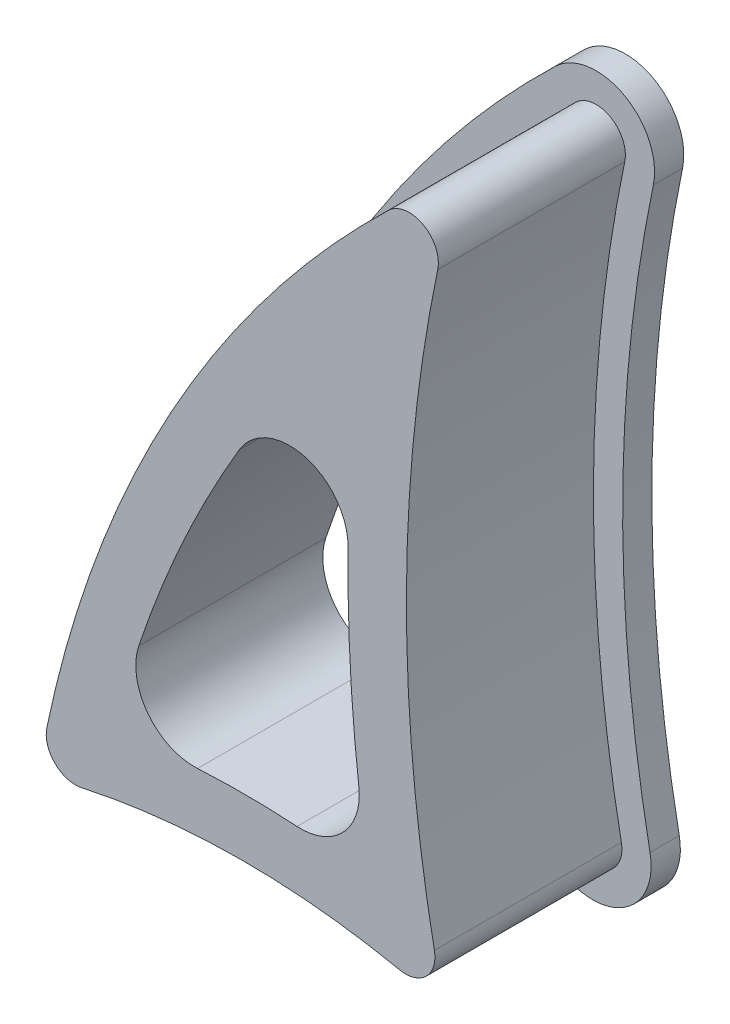
ISO-10303-21;
HEADER;
FILE_DESCRIPTION(('STEP AP214'),'2;1');
FILE_NAME('part.step','',(''),(''),'','','');
FILE_SCHEMA(('AUTOMOTIVE_DESIGN { 1 0 10303 214 1 1 1 1 }'));
ENDSEC;
DATA;
#1=APPLICATION_CONTEXT('core data for automotive mechanical design processes');
#2=APPLICATION_PROTOCOL_DEFINITION('international standard','automotive_design',2000,#1);
#3=PRODUCT_CONTEXT('',#1,'mechanical');
#4=PRODUCT('Part','Part','',(#3));
#5=PRODUCT_RELATED_PRODUCT_CATEGORY('part','',(#4));
#6=PRODUCT_DEFINITION_FORMATION('','',#4);
#7=PRODUCT_DEFINITION_CONTEXT('part definition',#1,'design');
#8=PRODUCT_DEFINITION('design','',#6,#7);
#9=PRODUCT_DEFINITION_SHAPE('','',#8);
#10=(LENGTH_UNIT() NAMED_UNIT(*) SI_UNIT(.MILLI.,.METRE.));
#11=(NAMED_UNIT(*) PLANE_ANGLE_UNIT() SI_UNIT($,.RADIAN.));
#12=(NAMED_UNIT(*) SI_UNIT($,.STERADIAN.) SOLID_ANGLE_UNIT());
#13=UNCERTAINTY_MEASURE_WITH_UNIT(LENGTH_MEASURE(1.E-05),#10,'distance_accuracy_value','');
#14=(GEOMETRIC_REPRESENTATION_CONTEXT(3) GLOBAL_UNCERTAINTY_ASSIGNED_CONTEXT((#13)) GLOBAL_UNIT_ASSIGNED_CONTEXT((#10,
#11,#12)) REPRESENTATION_CONTEXT('',''));
#15=CARTESIAN_POINT('',(0.,0.,0.));
#16=DIRECTION('',(0.,0.,1.));
#17=DIRECTION('',(1.,0.,0.));
#18=AXIS2_PLACEMENT_3D('',#15,#16,#17);
#19=CARTESIAN_POINT('',(48.320297770506,12.8510242148101,-1.));
#20=DIRECTION('',(0.,0.,1.));
#21=DIRECTION('',(1.,0.,0.));
#22=AXIS2_PLACEMENT_3D('',#19,#20,#21);
#23=CYLINDRICAL_SURFACE('',#22,50.);
#24=CARTESIAN_POINT('',(48.320297770506,12.8510242148101,0.));
#25=DIRECTION('',(0.,0.,1.));
#26=DIRECTION('',(1.,0.,0.));
#27=AXIS2_PLACEMENT_3D('',#24,#25,#26);
#28=CIRCLE('',#27,50.);
#29=CARTESIAN_POINT('',(-0.741475267234573,3.21035896840541,0.));
#30=VERTEX_POINT('',#29);
#31=CARTESIAN_POINT('',(-0.628577803238606,23.0494348785397,0.));
#32=VERTEX_POINT('',#31);
#33=EDGE_CURVE('E183',#30,#32,#28,.F.);
#34=ORIENTED_EDGE('',*,*,#33,.F.);
#35=DIRECTION('',(0.,0.,1.));
#36=VECTOR('',#35,1.);
#37=CARTESIAN_POINT('',(-0.741475267234573,3.21035896840541,-1.));
#38=LINE('',#37,#36);
#39=CARTESIAN_POINT('',(-0.741475267234573,3.21035896840541,-1.));
#40=VERTEX_POINT('',#39);
#41=EDGE_CURVE('E12',#40,#30,#38,.T.);
#42=ORIENTED_EDGE('',*,*,#41,.F.);
#43=CARTESIAN_POINT('',(48.320297770506,12.8510242148101,-1.));
#44=DIRECTION('',(0.,0.,1.));
#45=DIRECTION('',(1.,0.,0.));
#46=AXIS2_PLACEMENT_3D('',#43,#44,#45);
#47=CIRCLE('',#46,50.);
#48=CARTESIAN_POINT('',(-0.628577803238606,23.0494348785397,-1.));
#49=VERTEX_POINT('',#48);
#50=EDGE_CURVE('E236',#40,#49,#47,.F.);
#51=ORIENTED_EDGE('',*,*,#50,.T.);
#52=DIRECTION('',(0.,0.,1.));
#53=VECTOR('',#52,1.);
#54=CARTESIAN_POINT('',(-0.628577803238606,23.0494348785397,-1.));
#55=LINE('',#54,#53);
#56=EDGE_CURVE('E203',#49,#32,#55,.T.);
#57=ORIENTED_EDGE('',*,*,#56,.T.);
#58=EDGE_LOOP('',(#34,#42,#51,#57));
#59=FACE_BOUND('',#58,.T.);
#60=ADVANCED_FACE('F47',(#59),#23,.F.);
#61=CARTESIAN_POINT('',(-2.70394618874419,2.82473235854923,-1.));
#62=DIRECTION('',(0.,0.,1.));
#63=DIRECTION('',(1.,0.,0.));
#64=AXIS2_PLACEMENT_3D('',#61,#62,#63);
#65=CYLINDRICAL_SURFACE('',#64,2.);
#66=CARTESIAN_POINT('',(-2.70394618874419,2.82473235854923,0.));
#67=DIRECTION('',(0.,0.,1.));
#68=DIRECTION('',(1.,0.,0.));
#69=AXIS2_PLACEMENT_3D('',#66,#67,#68);
#70=CIRCLE('',#69,2.);
#71=CARTESIAN_POINT('',(-3.11476498957796,0.867380087525561,0.));
#72=VERTEX_POINT('',#71);
#73=EDGE_CURVE('E195',#72,#30,#70,.T.);
#74=ORIENTED_EDGE('',*,*,#73,.F.);
#75=DIRECTION('',(0.,0.,1.));
#76=VECTOR('',#75,1.);
#77=CARTESIAN_POINT('',(-3.11476498957796,0.867380087525561,-1.));
#78=LINE('',#77,#76);
#79=CARTESIAN_POINT('',(-3.11476498957796,0.867380087525561,-1.));
#80=VERTEX_POINT('',#79);
#81=EDGE_CURVE('E57',#80,#72,#78,.T.);
#82=ORIENTED_EDGE('',*,*,#81,.F.);
#83=CARTESIAN_POINT('',(-2.70394618874419,2.82473235854923,-1.));
#84=DIRECTION('',(0.,0.,1.));
#85=DIRECTION('',(1.,0.,0.));
#86=AXIS2_PLACEMENT_3D('',#83,#84,#85);
#87=CIRCLE('',#86,2.);
#88=EDGE_CURVE('E163',#80,#40,#87,.T.);
#89=ORIENTED_EDGE('',*,*,#88,.T.);
#90=ORIENTED_EDGE('',*,*,#41,.T.);
#91=EDGE_LOOP('',(#74,#82,#89,#90));
#92=FACE_BOUND('',#91,.T.);
#93=ADVANCED_FACE('F257',(#92),#65,.T.);
#94=CARTESIAN_POINT('',(-8.25,-23.5995233002703,-1.));
#95=DIRECTION('',(0.,0.,1.));
#96=DIRECTION('',(1.,0.,0.));
#97=AXIS2_PLACEMENT_3D('',#94,#95,#96);
#98=CYLINDRICAL_SURFACE('',#97,25.);
#99=CARTESIAN_POINT('',(-8.25,-23.5995233002703,0.));
#100=DIRECTION('',(0.,0.,1.));
#101=DIRECTION('',(1.,0.,0.));
#102=AXIS2_PLACEMENT_3D('',#99,#100,#101);
#103=CIRCLE('',#102,25.);
#104=CARTESIAN_POINT('',(-13.5802631482474,0.825633705784666,0.));
#105=VERTEX_POINT('',#104);
#106=EDGE_CURVE('E148',#105,#72,#103,.F.);
#107=ORIENTED_EDGE('',*,*,#106,.F.);
#108=DIRECTION('',(0.,0.,1.));
#109=VECTOR('',#108,1.);
#110=CARTESIAN_POINT('',(-13.5802631482474,0.825633705784666,-1.));
#111=LINE('',#110,#109);
#112=CARTESIAN_POINT('',(-13.5802631482474,0.825633705784666,-1.));
#113=VERTEX_POINT('',#112);
#114=EDGE_CURVE('E142',#113,#105,#111,.T.);
#115=ORIENTED_EDGE('',*,*,#114,.F.);
#116=CARTESIAN_POINT('',(-8.25,-23.5995233002703,-1.));
#117=DIRECTION('',(0.,0.,1.));
#118=DIRECTION('',(1.,0.,0.));
#119=AXIS2_PLACEMENT_3D('',#116,#117,#118);
#120=CIRCLE('',#119,25.);
#121=EDGE_CURVE('E146',#113,#80,#120,.F.);
#122=ORIENTED_EDGE('',*,*,#121,.T.);
#123=ORIENTED_EDGE('',*,*,#81,.T.);
#124=EDGE_LOOP('',(#107,#115,#122,#123));
#125=FACE_BOUND('',#124,.T.);
#126=ADVANCED_FACE('F144',(#125),#98,.F.);
#127=CARTESIAN_POINT('',(-14.0066842001072,2.77964626626907,-1.));
#128=DIRECTION('',(0.,0.,1.));
#129=DIRECTION('',(1.,0.,0.));
#130=AXIS2_PLACEMENT_3D('',#127,#128,#129);
#131=CYLINDRICAL_SURFACE('',#130,2.);
#132=CARTESIAN_POINT('',(-14.0066842001072,2.77964626626907,0.));
#133=DIRECTION('',(0.,0.,1.));
#134=DIRECTION('',(1.,0.,0.));
#135=AXIS2_PLACEMENT_3D('',#132,#133,#134);
#136=CIRCLE('',#135,2.);
#137=CARTESIAN_POINT('',(-15.9648626723684,3.1865087378403,0.));
#138=VERTEX_POINT('',#137);
#139=EDGE_CURVE('E192',#105,#138,#136,.F.);
#140=ORIENTED_EDGE('',*,*,#139,.T.);
#141=DIRECTION('',(0.,0.,1.));
#142=VECTOR('',#141,1.);
#143=CARTESIAN_POINT('',(-15.9648626723684,3.1865087378403,-1.));
#144=LINE('',#143,#142);
#145=CARTESIAN_POINT('',(-15.9648626723684,3.1865087378403,-1.));
#146=VERTEX_POINT('',#145);
#147=EDGE_CURVE('E152',#146,#138,#144,.T.);
#148=ORIENTED_EDGE('',*,*,#147,.F.);
#149=CARTESIAN_POINT('',(-14.0066842001072,2.77964626626907,-1.));
#150=DIRECTION('',(0.,0.,1.));
#151=DIRECTION('',(1.,0.,0.));
#152=AXIS2_PLACEMENT_3D('',#149,#150,#151);
#153=CIRCLE('',#152,2.);
#154=EDGE_CURVE('E155',#113,#146,#153,.F.);
#155=ORIENTED_EDGE('',*,*,#154,.F.);
#156=ORIENTED_EDGE('',*,*,#114,.T.);
#157=EDGE_LOOP('',(#140,#148,#155,#156));
#158=FACE_BOUND('',#157,.T.);
#159=ADVANCED_FACE('F156',(#158),#131,.T.);
#160=CARTESIAN_POINT('',(25.1568852451154,-5.35760316515583,-1.));
#161=DIRECTION('',(0.,0.,1.));
#162=DIRECTION('',(1.,0.,0.));
#163=AXIS2_PLACEMENT_3D('',#160,#161,#162);
#164=CYLINDRICAL_SURFACE('',#163,42.);
#165=CARTESIAN_POINT('',(25.1568852451154,-5.35760316515583,0.));
#166=DIRECTION('',(0.,0.,1.));
#167=DIRECTION('',(1.,0.,0.));
#168=AXIS2_PLACEMENT_3D('',#165,#166,#167);
#169=CIRCLE('',#168,42.);
#170=CARTESIAN_POINT('',(-3.97370372975359,24.8981200286011,0.));
#171=VERTEX_POINT('',#170);
#172=EDGE_CURVE('E189',#171,#138,#169,.T.);
#173=ORIENTED_EDGE('',*,*,#172,.F.);
#174=DIRECTION('',(0.,0.,1.));
#175=VECTOR('',#174,1.);
#176=CARTESIAN_POINT('',(-3.97370372975359,24.8981200286011,-1.));
#177=LINE('',#176,#175);
#178=CARTESIAN_POINT('',(-3.97370372975359,24.8981200286011,-1.));
#179=VERTEX_POINT('',#178);
#180=EDGE_CURVE('E201',#179,#171,#177,.T.);
#181=ORIENTED_EDGE('',*,*,#180,.F.);
#182=CARTESIAN_POINT('',(25.1568852451154,-5.35760316515583,-1.));
#183=DIRECTION('',(0.,0.,1.));
#184=DIRECTION('',(1.,0.,0.));
#185=AXIS2_PLACEMENT_3D('',#182,#183,#184);
#186=CIRCLE('',#185,42.);
#187=EDGE_CURVE('E160',#179,#146,#186,.T.);
#188=ORIENTED_EDGE('',*,*,#187,.T.);
#189=ORIENTED_EDGE('',*,*,#147,.T.);
#190=EDGE_LOOP('',(#173,#181,#188,#189));
#191=FACE_BOUND('',#190,.T.);
#192=ADVANCED_FACE('F252',(#191),#164,.T.);
#193=CARTESIAN_POINT('',(-2.58653282618839,23.4573713050889,-1.));
#194=DIRECTION('',(0.,0.,1.));
#195=DIRECTION('',(1.,0.,0.));
#196=AXIS2_PLACEMENT_3D('',#193,#194,#195);
#197=CYLINDRICAL_SURFACE('',#196,1.);
#198=CARTESIAN_POINT('',(-2.58653282618839,23.4573713050889,0.));
#199=DIRECTION('',(0.,0.,1.));
#200=DIRECTION('',(1.,0.,0.));
#201=AXIS2_PLACEMENT_3D('',#198,#199,#200);
#202=CIRCLE('',#201,1.);
#203=CARTESIAN_POINT('',(-1.60755531471349,23.2534030918143,0.));
#204=VERTEX_POINT('',#203);
#205=CARTESIAN_POINT('',(-3.28011827797098,24.177745666845,0.));
#206=VERTEX_POINT('',#205);
#207=EDGE_CURVE('E168',#204,#206,#202,.T.);
#208=ORIENTED_EDGE('',*,*,#207,.T.);
#209=DIRECTION('',(0.,0.,1.));
#210=VECTOR('',#209,1.);
#211=CARTESIAN_POINT('',(-3.28011827797098,24.177745666845,-1.));
#212=LINE('',#211,#210);
#213=CARTESIAN_POINT('',(-3.28011827797098,24.177745666845,-1.));
#214=VERTEX_POINT('',#213);
#215=EDGE_CURVE('E205',#214,#206,#212,.T.);
#216=ORIENTED_EDGE('',*,*,#215,.F.);
#217=CARTESIAN_POINT('',(-2.58653282618839,23.4573713050889,-1.));
#218=DIRECTION('',(0.,0.,1.));
#219=DIRECTION('',(1.,0.,0.));
#220=AXIS2_PLACEMENT_3D('',#217,#218,#219);
#221=CIRCLE('',#220,1.);
#222=CARTESIAN_POINT('',(-1.60755531471349,23.2534030918143,-1.));
#223=VERTEX_POINT('',#222);
#224=EDGE_CURVE('E197',#223,#214,#221,.T.);
#225=ORIENTED_EDGE('',*,*,#224,.F.);
#226=DIRECTION('',(0.,0.,1.));
#227=VECTOR('',#226,1.);
#228=CARTESIAN_POINT('',(-1.60755531471349,23.2534030918143,-1.));
#229=LINE('',#228,#227);
#230=EDGE_CURVE('E51',#223,#204,#229,.T.);
#231=ORIENTED_EDGE('',*,*,#230,.T.);
#232=EDGE_LOOP('',(#208,#216,#225,#231));
#233=FACE_BOUND('',#232,.T.);
#234=ADVANCED_FACE('F49',(#233),#197,.F.);
#235=CARTESIAN_POINT('',(25.1568852451154,-5.35760316515583,-1.));
#236=DIRECTION('',(0.,0.,1.));
#237=DIRECTION('',(1.,0.,0.));
#238=AXIS2_PLACEMENT_3D('',#235,#236,#237);
#239=CYLINDRICAL_SURFACE('',#238,41.);
#240=CARTESIAN_POINT('',(25.1568852451154,-5.35760316515583,0.));
#241=DIRECTION('',(0.,0.,1.));
#242=DIRECTION('',(1.,0.,0.));
#243=AXIS2_PLACEMENT_3D('',#240,#241,#242);
#244=CIRCLE('',#243,41.);
#245=CARTESIAN_POINT('',(-14.9857734362378,2.9830775020547,0.));
#246=VERTEX_POINT('',#245);
#247=EDGE_CURVE('E180',#206,#246,#244,.T.);
#248=ORIENTED_EDGE('',*,*,#247,.T.);
#249=DIRECTION('',(0.,0.,1.));
#250=VECTOR('',#249,1.);
#251=CARTESIAN_POINT('',(-14.9857734362378,2.9830775020547,-1.));
#252=LINE('',#251,#250);
#253=CARTESIAN_POINT('',(-14.9857734362378,2.9830775020547,-1.));
#254=VERTEX_POINT('',#253);
#255=EDGE_CURVE('E208',#254,#246,#252,.T.);
#256=ORIENTED_EDGE('',*,*,#255,.F.);
#257=CARTESIAN_POINT('',(25.1568852451154,-5.35760316515583,-1.));
#258=DIRECTION('',(0.,0.,1.));
#259=DIRECTION('',(1.,0.,0.));
#260=AXIS2_PLACEMENT_3D('',#257,#258,#259);
#261=CIRCLE('',#260,41.);
#262=EDGE_CURVE('E233',#214,#254,#261,.T.);
#263=ORIENTED_EDGE('',*,*,#262,.F.);
#264=ORIENTED_EDGE('',*,*,#215,.T.);
#265=EDGE_LOOP('',(#248,#256,#263,#264));
#266=FACE_BOUND('',#265,.T.);
#267=ADVANCED_FACE('F232',(#266),#239,.F.);
#268=CARTESIAN_POINT('',(-14.0066842001072,2.77964626626907,-1.));
#269=DIRECTION('',(0.,0.,1.));
#270=DIRECTION('',(1.,0.,0.));
#271=AXIS2_PLACEMENT_3D('',#268,#269,#270);
#272=CYLINDRICAL_SURFACE('',#271,0.999999999999997);
#273=CARTESIAN_POINT('',(-14.0066842001072,2.77964626626907,0.));
#274=DIRECTION('',(0.,0.,1.));
#275=DIRECTION('',(1.,0.,0.));
#276=AXIS2_PLACEMENT_3D('',#273,#274,#275);
#277=CIRCLE('',#276,0.999999999999997);
#278=CARTESIAN_POINT('',(-13.7934736741773,1.80263998602687,0.));
#279=VERTEX_POINT('',#278);
#280=EDGE_CURVE('E177',#279,#246,#277,.F.);
#281=ORIENTED_EDGE('',*,*,#280,.F.);
#282=DIRECTION('',(0.,0.,1.));
#283=VECTOR('',#282,1.);
#284=CARTESIAN_POINT('',(-13.7934736741773,1.80263998602687,-1.));
#285=LINE('',#284,#283);
#286=CARTESIAN_POINT('',(-13.7934736741773,1.80263998602687,-1.));
#287=VERTEX_POINT('',#286);
#288=EDGE_CURVE('E210',#287,#279,#285,.T.);
#289=ORIENTED_EDGE('',*,*,#288,.F.);
#290=CARTESIAN_POINT('',(-14.0066842001072,2.77964626626907,-1.));
#291=DIRECTION('',(0.,0.,1.));
#292=DIRECTION('',(1.,0.,0.));
#293=AXIS2_PLACEMENT_3D('',#290,#291,#292);
#294=CIRCLE('',#293,0.999999999999997);
#295=EDGE_CURVE('E237',#287,#254,#294,.F.);
#296=ORIENTED_EDGE('',*,*,#295,.T.);
#297=ORIENTED_EDGE('',*,*,#255,.T.);
#298=EDGE_LOOP('',(#281,#289,#296,#297));
#299=FACE_BOUND('',#298,.T.);
#300=ADVANCED_FACE('F275',(#299),#272,.F.);
#301=CARTESIAN_POINT('',(-8.25,-23.5995233002703,-1.));
#302=DIRECTION('',(0.,0.,1.));
#303=DIRECTION('',(1.,0.,0.));
#304=AXIS2_PLACEMENT_3D('',#301,#302,#303);
#305=CYLINDRICAL_SURFACE('',#304,26.);
#306=CARTESIAN_POINT('',(-8.25,-23.5995233002703,0.));
#307=DIRECTION('',(0.,0.,1.));
#308=DIRECTION('',(1.,0.,0.));
#309=AXIS2_PLACEMENT_3D('',#306,#307,#308);
#310=CIRCLE('',#309,26.);
#311=CARTESIAN_POINT('',(-2.90935558916107,1.84605622303739,0.));
#312=VERTEX_POINT('',#311);
#313=EDGE_CURVE('E175',#279,#312,#310,.F.);
#314=ORIENTED_EDGE('',*,*,#313,.T.);
#315=DIRECTION('',(0.,0.,1.));
#316=VECTOR('',#315,1.);
#317=CARTESIAN_POINT('',(-2.90935558916107,1.84605622303739,-1.));
#318=LINE('',#317,#316);
#319=CARTESIAN_POINT('',(-2.90935558916107,1.84605622303739,-1.));
#320=VERTEX_POINT('',#319);
#321=EDGE_CURVE('E212',#320,#312,#318,.T.);
#322=ORIENTED_EDGE('',*,*,#321,.F.);
#323=CARTESIAN_POINT('',(-8.25,-23.5995233002703,-1.));
#324=DIRECTION('',(0.,0.,1.));
#325=DIRECTION('',(1.,0.,0.));
#326=AXIS2_PLACEMENT_3D('',#323,#324,#325);
#327=CIRCLE('',#326,26.);
#328=EDGE_CURVE('E244',#287,#320,#327,.F.);
#329=ORIENTED_EDGE('',*,*,#328,.F.);
#330=ORIENTED_EDGE('',*,*,#288,.T.);
#331=EDGE_LOOP('',(#314,#322,#329,#330));
#332=FACE_BOUND('',#331,.T.);
#333=ADVANCED_FACE('F278',(#332),#305,.T.);
#334=CARTESIAN_POINT('',(-2.70394618874419,2.82473235854923,-1.));
#335=DIRECTION('',(0.,0.,1.));
#336=DIRECTION('',(1.,0.,0.));
#337=AXIS2_PLACEMENT_3D('',#334,#335,#336);
#338=CYLINDRICAL_SURFACE('',#337,1.);
#339=CARTESIAN_POINT('',(-2.70394618874419,2.82473235854923,0.));
#340=DIRECTION('',(0.,0.,1.));
#341=DIRECTION('',(1.,0.,0.));
#342=AXIS2_PLACEMENT_3D('',#339,#340,#341);
#343=CIRCLE('',#342,1.);
#344=CARTESIAN_POINT('',(-1.72271072798938,3.01754566347732,0.));
#345=VERTEX_POINT('',#344);
#346=EDGE_CURVE('E173',#312,#345,#343,.T.);
#347=ORIENTED_EDGE('',*,*,#346,.T.);
#348=DIRECTION('',(0.,0.,1.));
#349=VECTOR('',#348,1.);
#350=CARTESIAN_POINT('',(-1.72271072798938,3.01754566347732,-1.));
#351=LINE('',#350,#349);
#352=CARTESIAN_POINT('',(-1.72271072798938,3.01754566347732,-1.));
#353=VERTEX_POINT('',#352);
#354=EDGE_CURVE('E214',#353,#345,#351,.T.);
#355=ORIENTED_EDGE('',*,*,#354,.F.);
#356=CARTESIAN_POINT('',(-2.70394618874419,2.82473235854923,-1.));
#357=DIRECTION('',(0.,0.,1.));
#358=DIRECTION('',(1.,0.,0.));
#359=AXIS2_PLACEMENT_3D('',#356,#357,#358);
#360=CIRCLE('',#359,1.);
#361=EDGE_CURVE('E240',#320,#353,#360,.T.);
#362=ORIENTED_EDGE('',*,*,#361,.F.);
#363=ORIENTED_EDGE('',*,*,#321,.T.);
#364=EDGE_LOOP('',(#347,#355,#362,#363));
#365=FACE_BOUND('',#364,.T.);
#366=ADVANCED_FACE('F282',(#365),#338,.F.);
#367=CARTESIAN_POINT('',(48.320297770506,12.8510242148101,-1.));
#368=DIRECTION('',(0.,0.,1.));
#369=DIRECTION('',(1.,0.,0.));
#370=AXIS2_PLACEMENT_3D('',#367,#368,#369);
#371=CYLINDRICAL_SURFACE('',#370,51.);
#372=CARTESIAN_POINT('',(48.320297770506,12.8510242148101,0.));
#373=DIRECTION('',(0.,0.,1.));
#374=DIRECTION('',(1.,0.,0.));
#375=AXIS2_PLACEMENT_3D('',#372,#373,#374);
#376=CIRCLE('',#375,51.);
#377=EDGE_CURVE('E171',#345,#204,#376,.F.);
#378=ORIENTED_EDGE('',*,*,#377,.T.);
#379=ORIENTED_EDGE('',*,*,#230,.F.);
#380=CARTESIAN_POINT('',(48.320297770506,12.8510242148101,-1.));
#381=DIRECTION('',(0.,0.,1.));
#382=DIRECTION('',(1.,0.,0.));
#383=AXIS2_PLACEMENT_3D('',#380,#381,#382);
#384=CIRCLE('',#383,51.);
#385=EDGE_CURVE('E117',#353,#223,#384,.F.);
#386=ORIENTED_EDGE('',*,*,#385,.F.);
#387=ORIENTED_EDGE('',*,*,#354,.T.);
#388=EDGE_LOOP('',(#378,#379,#386,#387));
#389=FACE_BOUND('',#388,.T.);
#390=ADVANCED_FACE('F285',(#389),#371,.T.);
#391=CARTESIAN_POINT('',(-2.58653282618839,23.4573713050889,-1.));
#392=DIRECTION('',(0.,0.,1.));
#393=DIRECTION('',(1.,0.,0.));
#394=AXIS2_PLACEMENT_3D('',#391,#392,#393);
#395=CYLINDRICAL_SURFACE('',#394,2.);
#396=CARTESIAN_POINT('',(-2.58653282618839,23.4573713050889,0.));
#397=DIRECTION('',(0.,0.,1.));
#398=DIRECTION('',(1.,0.,0.));
#399=AXIS2_PLACEMENT_3D('',#396,#397,#398);
#400=CIRCLE('',#399,2.);
#401=EDGE_CURVE('E186',#32,#171,#400,.T.);
#402=ORIENTED_EDGE('',*,*,#401,.F.);
#403=ORIENTED_EDGE('',*,*,#56,.F.);
#404=CARTESIAN_POINT('',(-2.58653282618839,23.4573713050889,-1.));
#405=DIRECTION('',(0.,0.,1.));
#406=DIRECTION('',(1.,0.,0.));
#407=AXIS2_PLACEMENT_3D('',#404,#405,#406);
#408=CIRCLE('',#407,2.);
#409=EDGE_CURVE('E248',#49,#179,#408,.T.);
#410=ORIENTED_EDGE('',*,*,#409,.T.);
#411=ORIENTED_EDGE('',*,*,#180,.T.);
#412=EDGE_LOOP('',(#402,#403,#410,#411));
#413=FACE_BOUND('',#412,.T.);
#414=ADVANCED_FACE('F256',(#413),#395,.T.);
#415=CARTESIAN_POINT('',(0.,0.,-1.));
#416=DIRECTION('',(0.,0.,1.));
#417=DIRECTION('',(1.,0.,0.));
#418=AXIS2_PLACEMENT_3D('',#415,#416,#417);
#419=PLANE('',#418);
#420=ORIENTED_EDGE('',*,*,#224,.T.);
#421=ORIENTED_EDGE('',*,*,#262,.T.);
#422=ORIENTED_EDGE('',*,*,#295,.F.);
#423=ORIENTED_EDGE('',*,*,#328,.T.);
#424=ORIENTED_EDGE('',*,*,#361,.T.);
#425=ORIENTED_EDGE('',*,*,#385,.T.);
#426=EDGE_LOOP('',(#420,#421,#422,#423,#424,#425));
#427=FACE_BOUND('',#426,.T.);
#428=ORIENTED_EDGE('',*,*,#50,.F.);
#429=ORIENTED_EDGE('',*,*,#88,.F.);
#430=ORIENTED_EDGE('',*,*,#121,.F.);
#431=ORIENTED_EDGE('',*,*,#154,.T.);
#432=ORIENTED_EDGE('',*,*,#187,.F.);
#433=ORIENTED_EDGE('',*,*,#409,.F.);
#434=EDGE_LOOP('',(#428,#429,#430,#431,#432,#433));
#435=FACE_BOUND('',#434,.T.);
#436=ADVANCED_FACE('F162',(#427,#435),#419,.F.);
#437=CARTESIAN_POINT('',(0.,0.,0.));
#438=DIRECTION('',(0.,0.,1.));
#439=DIRECTION('',(1.,0.,0.));
#440=AXIS2_PLACEMENT_3D('',#437,#438,#439);
#441=PLANE('',#440);
#442=ORIENTED_EDGE('',*,*,#207,.F.);
#443=ORIENTED_EDGE('',*,*,#377,.F.);
#444=ORIENTED_EDGE('',*,*,#346,.F.);
#445=ORIENTED_EDGE('',*,*,#313,.F.);
#446=ORIENTED_EDGE('',*,*,#280,.T.);
#447=ORIENTED_EDGE('',*,*,#247,.F.);
#448=EDGE_LOOP('',(#442,#443,#444,#445,#446,#447));
#449=FACE_BOUND('',#448,.T.);
#450=ORIENTED_EDGE('',*,*,#33,.T.);
#451=ORIENTED_EDGE('',*,*,#401,.T.);
#452=ORIENTED_EDGE('',*,*,#172,.T.);
#453=ORIENTED_EDGE('',*,*,#139,.F.);
#454=ORIENTED_EDGE('',*,*,#106,.T.);
#455=ORIENTED_EDGE('',*,*,#73,.T.);
#456=EDGE_LOOP('',(#450,#451,#452,#453,#454,#455));
#457=FACE_BOUND('',#456,.T.);
#458=ADVANCED_FACE('F225',(#449,#457),#441,.T.);
#459=CLOSED_SHELL('',(#60,#93,#126,#159,#192,#234,#267,#300,#333,#366,#390,#414,#436,#458));
#460=MANIFOLD_SOLID_BREP('B2',#459);
#461=CARTESIAN_POINT('',(48.320297770506,12.8510242148101,6.4));
#462=DIRECTION('',(0.,0.,-1.));
#463=DIRECTION('',(-1.,0.,0.));
#464=AXIS2_PLACEMENT_3D('',#461,#462,#463);
#465=CYLINDRICAL_SURFACE('',#464,51.);
#466=CARTESIAN_POINT('',(48.320297770506,12.8510242148101,0.));
#467=DIRECTION('',(0.,0.,1.));
#468=DIRECTION('',(1.,0.,0.));
#469=AXIS2_PLACEMENT_3D('',#466,#467,#468);
#470=CIRCLE('',#469,51.);
#471=CARTESIAN_POINT('',(-1.72271072798938,3.01754566347732,0.));
#472=VERTEX_POINT('',#471);
#473=CARTESIAN_POINT('',(-1.60755531471349,23.2534030918143,0.));
#474=VERTEX_POINT('',#473);
#475=EDGE_CURVE('E524',#472,#474,#470,.F.);
#476=ORIENTED_EDGE('',*,*,#475,.T.);
#477=DIRECTION('',(0.,0.,-1.));
#478=VECTOR('',#477,1.);
#479=CARTESIAN_POINT('',(-1.60755531471349,23.2534030918143,6.4));
#480=LINE('',#479,#478);
#481=CARTESIAN_POINT('',(-1.60755531471349,23.2534030918143,6.4));
#482=VERTEX_POINT('',#481);
#483=EDGE_CURVE('E45',#482,#474,#480,.T.);
#484=ORIENTED_EDGE('',*,*,#483,.F.);
#485=CARTESIAN_POINT('',(48.320297770506,12.8510242148101,6.4));
#486=DIRECTION('',(0.,0.,1.));
#487=DIRECTION('',(1.,0.,0.));
#488=AXIS2_PLACEMENT_3D('',#485,#486,#487);
#489=CIRCLE('',#488,51.);
#490=CARTESIAN_POINT('',(-1.72271072798938,3.01754566347732,6.4));
#491=VERTEX_POINT('',#490);
#492=EDGE_CURVE('E583',#491,#482,#489,.F.);
#493=ORIENTED_EDGE('',*,*,#492,.F.);
#494=DIRECTION('',(0.,0.,-1.));
#495=VECTOR('',#494,1.);
#496=CARTESIAN_POINT('',(-1.72271072798938,3.01754566347732,6.4));
#497=LINE('',#496,#495);
#498=EDGE_CURVE('E536',#491,#472,#497,.T.);
#499=ORIENTED_EDGE('',*,*,#498,.T.);
#500=EDGE_LOOP('',(#476,#484,#493,#499));
#501=FACE_BOUND('',#500,.T.);
#502=ADVANCED_FACE('F381',(#501),#465,.F.);
#503=CARTESIAN_POINT('',(-2.58653282618839,23.4573713050889,6.4));
#504=DIRECTION('',(0.,0.,-1.));
#505=DIRECTION('',(-1.,0.,0.));
#506=AXIS2_PLACEMENT_3D('',#503,#504,#505);
#507=CYLINDRICAL_SURFACE('',#506,1.);
#508=CARTESIAN_POINT('',(-2.58653282618839,23.4573713050889,0.));
#509=DIRECTION('',(0.,0.,1.));
#510=DIRECTION('',(1.,0.,0.));
#511=AXIS2_PLACEMENT_3D('',#508,#509,#510);
#512=CIRCLE('',#511,1.);
#513=CARTESIAN_POINT('',(-3.28011827797098,24.177745666845,0.));
#514=VERTEX_POINT('',#513);
#515=EDGE_CURVE('E527',#474,#514,#512,.T.);
#516=ORIENTED_EDGE('',*,*,#515,.T.);
#517=DIRECTION('',(0.,0.,-1.));
#518=VECTOR('',#517,1.);
#519=CARTESIAN_POINT('',(-3.28011827797098,24.177745666845,6.4));
#520=LINE('',#519,#518);
#521=CARTESIAN_POINT('',(-3.28011827797098,24.177745666845,6.4));
#522=VERTEX_POINT('',#521);
#523=EDGE_CURVE('E391',#522,#514,#520,.T.);
#524=ORIENTED_EDGE('',*,*,#523,.F.);
#525=CARTESIAN_POINT('',(-2.58653282618839,23.4573713050889,6.4));
#526=DIRECTION('',(0.,0.,1.));
#527=DIRECTION('',(1.,0.,0.));
#528=AXIS2_PLACEMENT_3D('',#525,#526,#527);
#529=CIRCLE('',#528,1.);
#530=EDGE_CURVE('E500',#482,#522,#529,.T.);
#531=ORIENTED_EDGE('',*,*,#530,.F.);
#532=ORIENTED_EDGE('',*,*,#483,.T.);
#533=EDGE_LOOP('',(#516,#524,#531,#532));
#534=FACE_BOUND('',#533,.T.);
#535=ADVANCED_FACE('F588',(#534),#507,.T.);
#536=CARTESIAN_POINT('',(25.1568852451154,-5.35760316515583,6.4));
#537=DIRECTION('',(0.,0.,-1.));
#538=DIRECTION('',(-1.,0.,0.));
#539=AXIS2_PLACEMENT_3D('',#536,#537,#538);
#540=CYLINDRICAL_SURFACE('',#539,41.);
#541=CARTESIAN_POINT('',(25.1568852451154,-5.35760316515583,0.));
#542=DIRECTION('',(0.,0.,1.));
#543=DIRECTION('',(1.,0.,0.));
#544=AXIS2_PLACEMENT_3D('',#541,#542,#543);
#545=CIRCLE('',#544,41.);
#546=CARTESIAN_POINT('',(-14.9857734362378,2.9830775020547,0.));
#547=VERTEX_POINT('',#546);
#548=EDGE_CURVE('E529',#514,#547,#545,.T.);
#549=ORIENTED_EDGE('',*,*,#548,.T.);
#550=DIRECTION('',(0.,0.,-1.));
#551=VECTOR('',#550,1.);
#552=CARTESIAN_POINT('',(-14.9857734362378,2.9830775020547,6.4));
#553=LINE('',#552,#551);
#554=CARTESIAN_POINT('',(-14.9857734362378,2.9830775020547,6.4));
#555=VERTEX_POINT('',#554);
#556=EDGE_CURVE('E489',#555,#547,#553,.T.);
#557=ORIENTED_EDGE('',*,*,#556,.F.);
#558=CARTESIAN_POINT('',(25.1568852451154,-5.35760316515583,6.4));
#559=DIRECTION('',(0.,0.,1.));
#560=DIRECTION('',(1.,0.,0.));
#561=AXIS2_PLACEMENT_3D('',#558,#559,#560);
#562=CIRCLE('',#561,41.);
#563=EDGE_CURVE('E497',#522,#555,#562,.T.);
#564=ORIENTED_EDGE('',*,*,#563,.F.);
#565=ORIENTED_EDGE('',*,*,#523,.T.);
#566=EDGE_LOOP('',(#549,#557,#564,#565));
#567=FACE_BOUND('',#566,.T.);
#568=ADVANCED_FACE('F591',(#567),#540,.T.);
#569=CARTESIAN_POINT('',(-14.0066842001072,2.77964626626907,6.4));
#570=DIRECTION('',(0.,0.,-1.));
#571=DIRECTION('',(-1.,0.,0.));
#572=AXIS2_PLACEMENT_3D('',#569,#570,#571);
#573=CYLINDRICAL_SURFACE('',#572,0.999999999999997);
#574=CARTESIAN_POINT('',(-14.0066842001072,2.77964626626907,0.));
#575=DIRECTION('',(0.,0.,1.));
#576=DIRECTION('',(1.,0.,0.));
#577=AXIS2_PLACEMENT_3D('',#574,#575,#576);
#578=CIRCLE('',#577,0.999999999999997);
#579=CARTESIAN_POINT('',(-13.7934736741773,1.80263998602687,0.));
#580=VERTEX_POINT('',#579);
#581=EDGE_CURVE('E488',#580,#547,#578,.F.);
#582=ORIENTED_EDGE('',*,*,#581,.F.);
#583=DIRECTION('',(0.,0.,-1.));
#584=VECTOR('',#583,1.);
#585=CARTESIAN_POINT('',(-13.7934736741773,1.80263998602687,6.4));
#586=LINE('',#585,#584);
#587=CARTESIAN_POINT('',(-13.7934736741773,1.80263998602687,6.4));
#588=VERTEX_POINT('',#587);
#589=EDGE_CURVE('E482',#588,#580,#586,.T.);
#590=ORIENTED_EDGE('',*,*,#589,.F.);
#591=CARTESIAN_POINT('',(-14.0066842001072,2.77964626626907,6.4));
#592=DIRECTION('',(0.,0.,1.));
#593=DIRECTION('',(1.,0.,0.));
#594=AXIS2_PLACEMENT_3D('',#591,#592,#593);
#595=CIRCLE('',#594,0.999999999999997);
#596=EDGE_CURVE('E486',#588,#555,#595,.F.);
#597=ORIENTED_EDGE('',*,*,#596,.T.);
#598=ORIENTED_EDGE('',*,*,#556,.T.);
#599=EDGE_LOOP('',(#582,#590,#597,#598));
#600=FACE_BOUND('',#599,.T.);
#601=ADVANCED_FACE('F484',(#600),#573,.T.);
#602=CARTESIAN_POINT('',(-8.25,-23.5995233002703,6.4));
#603=DIRECTION('',(0.,0.,-1.));
#604=DIRECTION('',(-1.,0.,0.));
#605=AXIS2_PLACEMENT_3D('',#602,#603,#604);
#606=CYLINDRICAL_SURFACE('',#605,26.);
#607=CARTESIAN_POINT('',(-8.25,-23.5995233002703,0.));
#608=DIRECTION('',(0.,0.,1.));
#609=DIRECTION('',(1.,0.,0.));
#610=AXIS2_PLACEMENT_3D('',#607,#608,#609);
#611=CIRCLE('',#610,26.);
#612=CARTESIAN_POINT('',(-2.90935558916107,1.84605622303739,0.));
#613=VERTEX_POINT('',#612);
#614=EDGE_CURVE('E440',#580,#613,#611,.F.);
#615=ORIENTED_EDGE('',*,*,#614,.T.);
#616=DIRECTION('',(0.,0.,-1.));
#617=VECTOR('',#616,1.);
#618=CARTESIAN_POINT('',(-2.90935558916107,1.84605622303739,6.4));
#619=LINE('',#618,#617);
#620=CARTESIAN_POINT('',(-2.90935558916107,1.84605622303739,6.4));
#621=VERTEX_POINT('',#620);
#622=EDGE_CURVE('E490',#621,#613,#619,.T.);
#623=ORIENTED_EDGE('',*,*,#622,.F.);
#624=CARTESIAN_POINT('',(-8.25,-23.5995233002703,6.4));
#625=DIRECTION('',(0.,0.,1.));
#626=DIRECTION('',(1.,0.,0.));
#627=AXIS2_PLACEMENT_3D('',#624,#625,#626);
#628=CIRCLE('',#627,26.);
#629=EDGE_CURVE('E492',#588,#621,#628,.F.);
#630=ORIENTED_EDGE('',*,*,#629,.F.);
#631=ORIENTED_EDGE('',*,*,#589,.T.);
#632=EDGE_LOOP('',(#615,#623,#630,#631));
#633=FACE_BOUND('',#632,.T.);
#634=ADVANCED_FACE('F493',(#633),#606,.F.);
#635=CARTESIAN_POINT('',(-6.29253582125286,6.33654748380092,6.4));
#636=DIRECTION('',(0.,0.,-1.));
#637=DIRECTION('',(-1.,0.,0.));
#638=AXIS2_PLACEMENT_3D('',#635,#636,#637);
#639=CYLINDRICAL_SURFACE('',#638,2.);
#640=CARTESIAN_POINT('',(-6.29253582125286,6.33654748380092,0.));
#641=DIRECTION('',(0.,0.,1.));
#642=DIRECTION('',(1.,0.,0.));
#643=AXIS2_PLACEMENT_3D('',#640,#641,#642);
#644=CIRCLE('',#643,2.);
#645=CARTESIAN_POINT('',(-6.42303343316933,4.34080943152951,0.));
#646=VERTEX_POINT('',#645);
#647=CARTESIAN_POINT('',(-4.30661459973436,6.57343754674671,0.));
#648=VERTEX_POINT('',#647);
#649=EDGE_CURVE('E506',#646,#648,#644,.T.);
#650=ORIENTED_EDGE('',*,*,#649,.F.);
#651=DIRECTION('',(0.,0.,-1.));
#652=VECTOR('',#651,1.);
#653=CARTESIAN_POINT('',(-6.42303343316933,4.34080943152951,6.4));
#654=LINE('',#653,#652);
#655=CARTESIAN_POINT('',(-6.42303343316933,4.34080943152951,6.4));
#656=VERTEX_POINT('',#655);
#657=EDGE_CURVE('E385',#656,#646,#654,.T.);
#658=ORIENTED_EDGE('',*,*,#657,.F.);
#659=CARTESIAN_POINT('',(-6.29253582125286,6.33654748380092,6.4));
#660=DIRECTION('',(0.,0.,1.));
#661=DIRECTION('',(1.,0.,0.));
#662=AXIS2_PLACEMENT_3D('',#659,#660,#661);
#663=CIRCLE('',#662,2.);
#664=CARTESIAN_POINT('',(-4.30661459973436,6.57343754674671,6.4));
#665=VERTEX_POINT('',#664);
#666=EDGE_CURVE('E535',#656,#665,#663,.T.);
#667=ORIENTED_EDGE('',*,*,#666,.T.);
#668=DIRECTION('',(0.,0.,-1.));
#669=VECTOR('',#668,1.);
#670=CARTESIAN_POINT('',(-4.30661459973436,6.57343754674671,6.4));
#671=LINE('',#670,#669);
#672=EDGE_CURVE('E505',#665,#648,#671,.T.);
#673=ORIENTED_EDGE('',*,*,#672,.T.);
#674=EDGE_LOOP('',(#650,#658,#667,#673));
#675=FACE_BOUND('',#674,.T.);
#676=ADVANCED_FACE('F383',(#675),#639,.F.);
#677=CARTESIAN_POINT('',(-8.25,-23.5995233002703,6.4));
#678=DIRECTION('',(0.,0.,-1.));
#679=DIRECTION('',(-1.,0.,0.));
#680=AXIS2_PLACEMENT_3D('',#677,#678,#679);
#681=CYLINDRICAL_SURFACE('',#680,28.);
#682=CARTESIAN_POINT('',(-8.25,-23.5995233002703,0.));
#683=DIRECTION('',(0.,0.,1.));
#684=DIRECTION('',(1.,0.,0.));
#685=AXIS2_PLACEMENT_3D('',#682,#683,#684);
#686=CIRCLE('',#685,28.);
#687=CARTESIAN_POINT('',(-9.82833929483457,4.35595639638992,0.));
#688=VERTEX_POINT('',#687);
#689=EDGE_CURVE('E509',#688,#646,#686,.F.);
#690=ORIENTED_EDGE('',*,*,#689,.F.);
#691=DIRECTION('',(0.,0.,-1.));
#692=VECTOR('',#691,1.);
#693=CARTESIAN_POINT('',(-9.82833929483457,4.35595639638992,6.4));
#694=LINE('',#693,#692);
#695=CARTESIAN_POINT('',(-9.82833929483457,4.35595639638992,6.4));
#696=VERTEX_POINT('',#695);
#697=EDGE_CURVE('E548',#696,#688,#694,.T.);
#698=ORIENTED_EDGE('',*,*,#697,.F.);
#699=CARTESIAN_POINT('',(-8.25,-23.5995233002703,6.4));
#700=DIRECTION('',(0.,0.,1.));
#701=DIRECTION('',(1.,0.,0.));
#702=AXIS2_PLACEMENT_3D('',#699,#700,#701);
#703=CIRCLE('',#702,28.);
#704=EDGE_CURVE('E557',#696,#656,#703,.F.);
#705=ORIENTED_EDGE('',*,*,#704,.T.);
#706=ORIENTED_EDGE('',*,*,#657,.T.);
#707=EDGE_LOOP('',(#690,#698,#705,#706));
#708=FACE_BOUND('',#707,.T.);
#709=ADVANCED_FACE('F555',(#708),#681,.T.);
#710=CARTESIAN_POINT('',(-9.94107781589418,6.3527763747228,6.4));
#711=DIRECTION('',(0.,0.,-1.));
#712=DIRECTION('',(-1.,0.,0.));
#713=AXIS2_PLACEMENT_3D('',#710,#711,#712);
#714=CYLINDRICAL_SURFACE('',#713,2.);
#715=CARTESIAN_POINT('',(-9.94107781589418,6.3527763747228,0.));
#716=DIRECTION('',(0.,0.,1.));
#717=DIRECTION('',(1.,0.,0.));
#718=AXIS2_PLACEMENT_3D('',#715,#716,#717);
#719=CIRCLE('',#718,2.);
#720=CARTESIAN_POINT('',(-11.8382650083812,6.98576986336488,0.));
#721=VERTEX_POINT('',#720);
#722=EDGE_CURVE('E512',#688,#721,#719,.F.);
#723=ORIENTED_EDGE('',*,*,#722,.T.);
#724=DIRECTION('',(0.,0.,-1.));
#725=VECTOR('',#724,1.);
#726=CARTESIAN_POINT('',(-11.8382650083812,6.98576986336488,6.4));
#727=LINE('',#726,#725);
#728=CARTESIAN_POINT('',(-11.8382650083812,6.98576986336488,6.4));
#729=VERTEX_POINT('',#728);
#730=EDGE_CURVE('E547',#729,#721,#727,.T.);
#731=ORIENTED_EDGE('',*,*,#730,.F.);
#732=CARTESIAN_POINT('',(-9.94107781589418,6.3527763747228,6.4));
#733=DIRECTION('',(0.,0.,1.));
#734=DIRECTION('',(1.,0.,0.));
#735=AXIS2_PLACEMENT_3D('',#732,#733,#734);
#736=CIRCLE('',#735,2.);
#737=EDGE_CURVE('E566',#696,#729,#736,.F.);
#738=ORIENTED_EDGE('',*,*,#737,.F.);
#739=ORIENTED_EDGE('',*,*,#697,.T.);
#740=EDGE_LOOP('',(#723,#731,#738,#739));
#741=FACE_BOUND('',#740,.T.);
#742=ADVANCED_FACE('F564',(#741),#714,.F.);
#743=CARTESIAN_POINT('',(25.1568852451154,-5.35760316515583,6.4));
#744=DIRECTION('',(0.,0.,-1.));
#745=DIRECTION('',(-1.,0.,0.));
#746=AXIS2_PLACEMENT_3D('',#743,#744,#745);
#747=CYLINDRICAL_SURFACE('',#746,39.);
#748=CARTESIAN_POINT('',(25.1568852451154,-5.35760316515583,0.));
#749=DIRECTION('',(0.,0.,1.));
#750=DIRECTION('',(1.,0.,0.));
#751=AXIS2_PLACEMENT_3D('',#748,#749,#750);
#752=CIRCLE('',#751,39.);
#753=CARTESIAN_POINT('',(-8.39654059619053,14.5212200976026,0.));
#754=VERTEX_POINT('',#753);
#755=EDGE_CURVE('E515',#754,#721,#752,.T.);
#756=ORIENTED_EDGE('',*,*,#755,.F.);
#757=DIRECTION('',(0.,0.,-1.));
#758=VECTOR('',#757,1.);
#759=CARTESIAN_POINT('',(-8.39654059619053,14.5212200976026,6.4));
#760=LINE('',#759,#758);
#761=CARTESIAN_POINT('',(-8.39654059619053,14.5212200976026,6.4));
#762=VERTEX_POINT('',#761);
#763=EDGE_CURVE('E545',#762,#754,#760,.T.);
#764=ORIENTED_EDGE('',*,*,#763,.F.);
#765=CARTESIAN_POINT('',(25.1568852451154,-5.35760316515583,6.4));
#766=DIRECTION('',(0.,0.,1.));
#767=DIRECTION('',(1.,0.,0.));
#768=AXIS2_PLACEMENT_3D('',#765,#766,#767);
#769=CIRCLE('',#768,39.);
#770=EDGE_CURVE('E569',#762,#729,#769,.T.);
#771=ORIENTED_EDGE('',*,*,#770,.T.);
#772=ORIENTED_EDGE('',*,*,#730,.T.);
#773=EDGE_LOOP('',(#756,#764,#771,#772));
#774=FACE_BOUND('',#773,.T.);
#775=ADVANCED_FACE('F570',(#774),#747,.F.);
#776=CARTESIAN_POINT('',(-6.67585209150818,13.5017932636149,6.4));
#777=DIRECTION('',(0.,0.,-1.));
#778=DIRECTION('',(-1.,0.,0.));
#779=AXIS2_PLACEMENT_3D('',#776,#777,#778);
#780=CYLINDRICAL_SURFACE('',#779,2.);
#781=CARTESIAN_POINT('',(-6.67585209150818,13.5017932636149,0.));
#782=DIRECTION('',(0.,0.,1.));
#783=DIRECTION('',(1.,0.,0.));
#784=AXIS2_PLACEMENT_3D('',#781,#782,#783);
#785=CIRCLE('',#784,2.);
#786=CARTESIAN_POINT('',(-4.67599209652585,13.4781289345675,0.));
#787=VERTEX_POINT('',#786);
#788=EDGE_CURVE('E518',#787,#754,#785,.T.);
#789=ORIENTED_EDGE('',*,*,#788,.F.);
#790=DIRECTION('',(0.,0.,-1.));
#791=VECTOR('',#790,1.);
#792=CARTESIAN_POINT('',(-4.67599209652585,13.4781289345675,6.4));
#793=LINE('',#792,#791);
#794=CARTESIAN_POINT('',(-4.67599209652585,13.4781289345675,6.4));
#795=VERTEX_POINT('',#794);
#796=EDGE_CURVE('E543',#795,#787,#793,.T.);
#797=ORIENTED_EDGE('',*,*,#796,.F.);
#798=CARTESIAN_POINT('',(-6.67585209150818,13.5017932636149,6.4));
#799=DIRECTION('',(0.,0.,1.));
#800=DIRECTION('',(1.,0.,0.));
#801=AXIS2_PLACEMENT_3D('',#798,#799,#800);
#802=CIRCLE('',#801,2.);
#803=EDGE_CURVE('E574',#795,#762,#802,.T.);
#804=ORIENTED_EDGE('',*,*,#803,.T.);
#805=ORIENTED_EDGE('',*,*,#763,.T.);
#806=EDGE_LOOP('',(#789,#797,#804,#805));
#807=FACE_BOUND('',#806,.T.);
#808=ADVANCED_FACE('F603',(#807),#780,.F.);
#809=CARTESIAN_POINT('',(48.320297770506,12.8510242148101,6.4));
#810=DIRECTION('',(0.,0.,-1.));
#811=DIRECTION('',(-1.,0.,0.));
#812=AXIS2_PLACEMENT_3D('',#809,#810,#811);
#813=CYLINDRICAL_SURFACE('',#812,53.);
#814=CARTESIAN_POINT('',(48.320297770506,12.8510242148101,0.));
#815=DIRECTION('',(0.,0.,1.));
#816=DIRECTION('',(1.,0.,0.));
#817=AXIS2_PLACEMENT_3D('',#814,#815,#816);
#818=CIRCLE('',#817,53.);
#819=EDGE_CURVE('E521',#648,#787,#818,.F.);
#820=ORIENTED_EDGE('',*,*,#819,.F.);
#821=ORIENTED_EDGE('',*,*,#672,.F.);
#822=CARTESIAN_POINT('',(48.320297770506,12.8510242148101,6.4));
#823=DIRECTION('',(0.,0.,1.));
#824=DIRECTION('',(1.,0.,0.));
#825=AXIS2_PLACEMENT_3D('',#822,#823,#824);
#826=CIRCLE('',#825,53.);
#827=EDGE_CURVE('E576',#665,#795,#826,.F.);
#828=ORIENTED_EDGE('',*,*,#827,.T.);
#829=ORIENTED_EDGE('',*,*,#796,.T.);
#830=EDGE_LOOP('',(#820,#821,#828,#829));
#831=FACE_BOUND('',#830,.T.);
#832=ADVANCED_FACE('F596',(#831),#813,.T.);
#833=CARTESIAN_POINT('',(-2.70394618874419,2.82473235854923,6.4));
#834=DIRECTION('',(0.,0.,-1.));
#835=DIRECTION('',(-1.,0.,0.));
#836=AXIS2_PLACEMENT_3D('',#833,#834,#835);
#837=CYLINDRICAL_SURFACE('',#836,1.);
#838=CARTESIAN_POINT('',(-2.70394618874419,2.82473235854923,0.));
#839=DIRECTION('',(0.,0.,1.));
#840=DIRECTION('',(1.,0.,0.));
#841=AXIS2_PLACEMENT_3D('',#838,#839,#840);
#842=CIRCLE('',#841,1.);
#843=EDGE_CURVE('E446',#613,#472,#842,.T.);
#844=ORIENTED_EDGE('',*,*,#843,.T.);
#845=ORIENTED_EDGE('',*,*,#498,.F.);
#846=CARTESIAN_POINT('',(-2.70394618874419,2.82473235854923,6.4));
#847=DIRECTION('',(0.,0.,1.));
#848=DIRECTION('',(1.,0.,0.));
#849=AXIS2_PLACEMENT_3D('',#846,#847,#848);
#850=CIRCLE('',#849,1.);
#851=EDGE_CURVE('E400',#621,#491,#850,.T.);
#852=ORIENTED_EDGE('',*,*,#851,.F.);
#853=ORIENTED_EDGE('',*,*,#622,.T.);
#854=EDGE_LOOP('',(#844,#845,#852,#853));
#855=FACE_BOUND('',#854,.T.);
#856=ADVANCED_FACE('F594',(#855),#837,.T.);
#857=CARTESIAN_POINT('',(0.,0.,6.4));
#858=DIRECTION('',(0.,0.,1.));
#859=DIRECTION('',(1.,0.,0.));
#860=AXIS2_PLACEMENT_3D('',#857,#858,#859);
#861=PLANE('',#860);
#862=ORIENTED_EDGE('',*,*,#666,.F.);
#863=ORIENTED_EDGE('',*,*,#704,.F.);
#864=ORIENTED_EDGE('',*,*,#737,.T.);
#865=ORIENTED_EDGE('',*,*,#770,.F.);
#866=ORIENTED_EDGE('',*,*,#803,.F.);
#867=ORIENTED_EDGE('',*,*,#827,.F.);
#868=EDGE_LOOP('',(#862,#863,#864,#865,#866,#867));
#869=FACE_BOUND('',#868,.T.);
#870=ORIENTED_EDGE('',*,*,#492,.T.);
#871=ORIENTED_EDGE('',*,*,#530,.T.);
#872=ORIENTED_EDGE('',*,*,#563,.T.);
#873=ORIENTED_EDGE('',*,*,#596,.F.);
#874=ORIENTED_EDGE('',*,*,#629,.T.);
#875=ORIENTED_EDGE('',*,*,#851,.T.);
#876=EDGE_LOOP('',(#870,#871,#872,#873,#874,#875));
#877=FACE_BOUND('',#876,.T.);
#878=ADVANCED_FACE('F495',(#869,#877),#861,.T.);
#879=CARTESIAN_POINT('',(0.,0.,0.));
#880=DIRECTION('',(0.,0.,1.));
#881=DIRECTION('',(1.,0.,0.));
#882=AXIS2_PLACEMENT_3D('',#879,#880,#881);
#883=PLANE('',#882);
#884=ORIENTED_EDGE('',*,*,#649,.T.);
#885=ORIENTED_EDGE('',*,*,#819,.T.);
#886=ORIENTED_EDGE('',*,*,#788,.T.);
#887=ORIENTED_EDGE('',*,*,#755,.T.);
#888=ORIENTED_EDGE('',*,*,#722,.F.);
#889=ORIENTED_EDGE('',*,*,#689,.T.);
#890=EDGE_LOOP('',(#884,#885,#886,#887,#888,#889));
#891=FACE_BOUND('',#890,.T.);
#892=ORIENTED_EDGE('',*,*,#475,.F.);
#893=ORIENTED_EDGE('',*,*,#843,.F.);
#894=ORIENTED_EDGE('',*,*,#614,.F.);
#895=ORIENTED_EDGE('',*,*,#581,.T.);
#896=ORIENTED_EDGE('',*,*,#548,.F.);
#897=ORIENTED_EDGE('',*,*,#515,.F.);
#898=EDGE_LOOP('',(#892,#893,#894,#895,#896,#897));
#899=FACE_BOUND('',#898,.T.);
#900=ADVANCED_FACE('F560',(#891,#899),#883,.F.);
#901=CLOSED_SHELL('',(#502,#535,#568,#601,#634,#676,#709,#742,#775,#808,#832,#856,#878,#900));
#902=MANIFOLD_SOLID_BREP('B6',#901);
#903=ADVANCED_BREP_SHAPE_REPRESENTATION('',(#18,#460,#902),#14);
#904=SHAPE_DEFINITION_REPRESENTATION(#9,#903);
ENDSEC;
END-ISO-10303-21;
